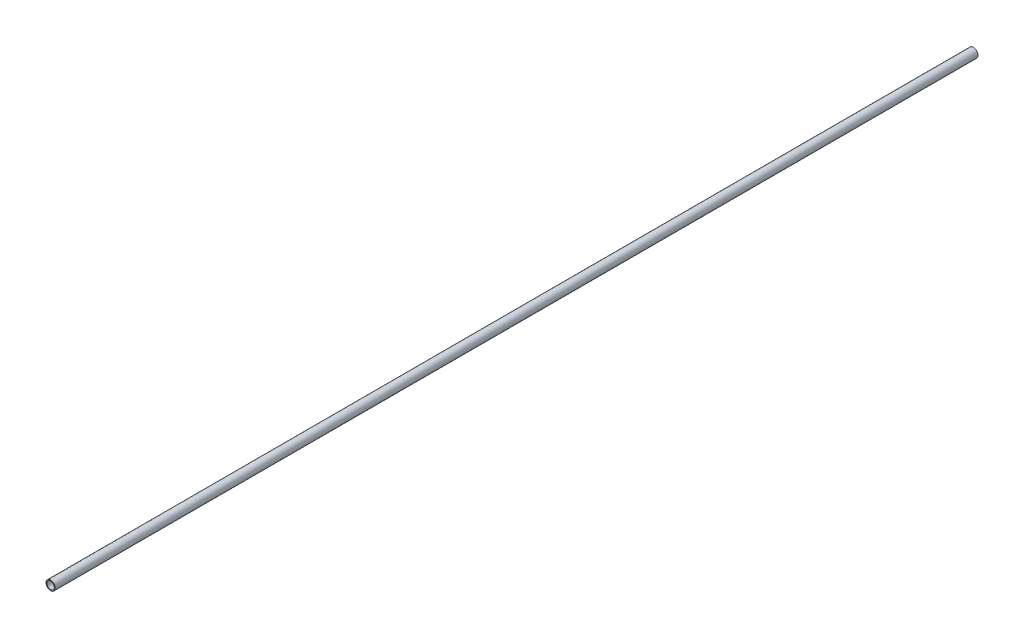
ISO-10303-21;
HEADER;
FILE_DESCRIPTION(('STEP AP214'),'2;1');
FILE_NAME('part.step','',(''),(''),'','','');
FILE_SCHEMA(('AUTOMOTIVE_DESIGN { 1 0 10303 214 1 1 1 1 }'));
ENDSEC;
DATA;
#1=APPLICATION_CONTEXT('core data for automotive mechanical design processes');
#2=APPLICATION_PROTOCOL_DEFINITION('international standard','automotive_design',2000,#1);
#3=PRODUCT_CONTEXT('',#1,'mechanical');
#4=PRODUCT('Part','Part','',(#3));
#5=PRODUCT_RELATED_PRODUCT_CATEGORY('part','',(#4));
#6=PRODUCT_DEFINITION_FORMATION('','',#4);
#7=PRODUCT_DEFINITION_CONTEXT('part definition',#1,'design');
#8=PRODUCT_DEFINITION('design','',#6,#7);
#9=PRODUCT_DEFINITION_SHAPE('','',#8);
#10=(LENGTH_UNIT() NAMED_UNIT(*) SI_UNIT(.MILLI.,.METRE.));
#11=(NAMED_UNIT(*) PLANE_ANGLE_UNIT() SI_UNIT($,.RADIAN.));
#12=(NAMED_UNIT(*) SI_UNIT($,.STERADIAN.) SOLID_ANGLE_UNIT());
#13=UNCERTAINTY_MEASURE_WITH_UNIT(LENGTH_MEASURE(1.E-05),#10,'distance_accuracy_value','');
#14=(GEOMETRIC_REPRESENTATION_CONTEXT(3) GLOBAL_UNCERTAINTY_ASSIGNED_CONTEXT((#13)) GLOBAL_UNIT_ASSIGNED_CONTEXT((#10,
#11,#12)) REPRESENTATION_CONTEXT('',''));
#15=CARTESIAN_POINT('',(0.,0.,0.));
#16=DIRECTION('',(0.,0.,1.));
#17=DIRECTION('',(1.,0.,0.));
#18=AXIS2_PLACEMENT_3D('',#15,#16,#17);
#19=CARTESIAN_POINT('',(0.,0.,500.));
#20=DIRECTION('',(0.,0.,1.));
#21=DIRECTION('',(1.,0.,0.));
#22=AXIS2_PLACEMENT_3D('',#19,#20,#21);
#23=PLANE('',#22);
#24=CARTESIAN_POINT('',(0.,0.,500.));
#25=DIRECTION('',(0.,0.,1.));
#26=DIRECTION('',(1.,0.,0.));
#27=AXIS2_PLACEMENT_3D('',#24,#25,#26);
#28=CIRCLE('',#27,5.);
#29=CARTESIAN_POINT('',(5.,0.,500.));
#30=VERTEX_POINT('',#29);
#31=EDGE_CURVE('E10',#30,#30,#28,.T.);
#32=ORIENTED_EDGE('',*,*,#31,.T.);
#33=EDGE_LOOP('',(#32));
#34=FACE_BOUND('',#33,.T.);
#35=CARTESIAN_POINT('',(0.,0.,500.));
#36=DIRECTION('',(0.,0.,1.));
#37=DIRECTION('',(1.,0.,0.));
#38=AXIS2_PLACEMENT_3D('',#35,#36,#37);
#39=CIRCLE('',#38,4.);
#40=CARTESIAN_POINT('',(4.,0.,500.));
#41=VERTEX_POINT('',#40);
#42=EDGE_CURVE('E50',#41,#41,#39,.T.);
#43=ORIENTED_EDGE('',*,*,#42,.F.);
#44=EDGE_LOOP('',(#43));
#45=FACE_BOUND('',#44,.T.);
#46=ADVANCED_FACE('F37',(#34,#45),#23,.T.);
#47=CARTESIAN_POINT('',(0.,0.,-500.));
#48=DIRECTION('',(0.,0.,1.));
#49=DIRECTION('',(1.,0.,0.));
#50=AXIS2_PLACEMENT_3D('',#47,#48,#49);
#51=PLANE('',#50);
#52=CARTESIAN_POINT('',(0.,0.,-500.));
#53=DIRECTION('',(0.,0.,1.));
#54=DIRECTION('',(1.,0.,0.));
#55=AXIS2_PLACEMENT_3D('',#52,#53,#54);
#56=CIRCLE('',#55,5.);
#57=CARTESIAN_POINT('',(5.,0.,-500.));
#58=VERTEX_POINT('',#57);
#59=EDGE_CURVE('E41',#58,#58,#56,.T.);
#60=ORIENTED_EDGE('',*,*,#59,.F.);
#61=EDGE_LOOP('',(#60));
#62=FACE_BOUND('',#61,.T.);
#63=CARTESIAN_POINT('',(0.,0.,-500.));
#64=DIRECTION('',(0.,0.,1.));
#65=DIRECTION('',(1.,0.,0.));
#66=AXIS2_PLACEMENT_3D('',#63,#64,#65);
#67=CIRCLE('',#66,4.);
#68=CARTESIAN_POINT('',(4.,0.,-500.));
#69=VERTEX_POINT('',#68);
#70=EDGE_CURVE('E52',#69,#69,#67,.T.);
#71=ORIENTED_EDGE('',*,*,#70,.T.);
#72=EDGE_LOOP('',(#71));
#73=FACE_BOUND('',#72,.T.);
#74=ADVANCED_FACE('F64',(#62,#73),#51,.F.);
#75=CARTESIAN_POINT('',(0.,0.,500.));
#76=DIRECTION('',(0.,0.,-1.));
#77=DIRECTION('',(-1.,0.,0.));
#78=AXIS2_PLACEMENT_3D('',#75,#76,#77);
#79=CYLINDRICAL_SURFACE('',#78,5.);
#80=ORIENTED_EDGE('',*,*,#31,.F.);
#81=EDGE_LOOP('',(#80));
#82=FACE_BOUND('',#81,.T.);
#83=ORIENTED_EDGE('',*,*,#59,.T.);
#84=EDGE_LOOP('',(#83));
#85=FACE_BOUND('',#84,.T.);
#86=ADVANCED_FACE('F39',(#82,#85),#79,.T.);
#87=CARTESIAN_POINT('',(0.,0.,500.));
#88=DIRECTION('',(0.,0.,-1.));
#89=DIRECTION('',(-1.,0.,0.));
#90=AXIS2_PLACEMENT_3D('',#87,#88,#89);
#91=CYLINDRICAL_SURFACE('',#90,4.);
#92=ORIENTED_EDGE('',*,*,#42,.T.);
#93=EDGE_LOOP('',(#92));
#94=FACE_BOUND('',#93,.T.);
#95=ORIENTED_EDGE('',*,*,#70,.F.);
#96=EDGE_LOOP('',(#95));
#97=FACE_BOUND('',#96,.T.);
#98=ADVANCED_FACE('F60',(#94,#97),#91,.F.);
#99=CLOSED_SHELL('',(#46,#74,#86,#98));
#100=MANIFOLD_SOLID_BREP('B2',#99);
#101=ADVANCED_BREP_SHAPE_REPRESENTATION('',(#18,#100),#14);
#102=SHAPE_DEFINITION_REPRESENTATION(#9,#101);
ENDSEC;
END-ISO-10303-21;
